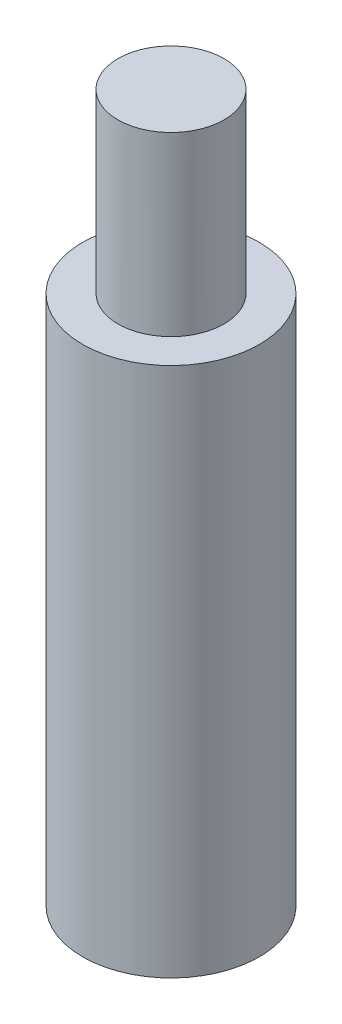
ISO-10303-21;
HEADER;
FILE_DESCRIPTION(('STEP AP214'),'2;1');
FILE_NAME('part.step','',(''),(''),'','','');
FILE_SCHEMA(('AUTOMOTIVE_DESIGN { 1 0 10303 214 1 1 1 1 }'));
ENDSEC;
DATA;
#1=APPLICATION_CONTEXT('core data for automotive mechanical design processes');
#2=APPLICATION_PROTOCOL_DEFINITION('international standard','automotive_design',2000,#1);
#3=PRODUCT_CONTEXT('',#1,'mechanical');
#4=PRODUCT('Part','Part','',(#3));
#5=PRODUCT_RELATED_PRODUCT_CATEGORY('part','',(#4));
#6=PRODUCT_DEFINITION_FORMATION('','',#4);
#7=PRODUCT_DEFINITION_CONTEXT('part definition',#1,'design');
#8=PRODUCT_DEFINITION('design','',#6,#7);
#9=PRODUCT_DEFINITION_SHAPE('','',#8);
#10=(LENGTH_UNIT() NAMED_UNIT(*) SI_UNIT(.MILLI.,.METRE.));
#11=(NAMED_UNIT(*) PLANE_ANGLE_UNIT() SI_UNIT($,.RADIAN.));
#12=(NAMED_UNIT(*) SI_UNIT($,.STERADIAN.) SOLID_ANGLE_UNIT());
#13=UNCERTAINTY_MEASURE_WITH_UNIT(LENGTH_MEASURE(1.E-05),#10,'distance_accuracy_value','');
#14=(GEOMETRIC_REPRESENTATION_CONTEXT(3) GLOBAL_UNCERTAINTY_ASSIGNED_CONTEXT((#13)) GLOBAL_UNIT_ASSIGNED_CONTEXT((#10,
#11,#12)) REPRESENTATION_CONTEXT('',''));
#15=CARTESIAN_POINT('',(0.,0.,0.));
#16=DIRECTION('',(0.,0.,1.));
#17=DIRECTION('',(1.,0.,0.));
#18=AXIS2_PLACEMENT_3D('',#15,#16,#17);
#19=CARTESIAN_POINT('',(0.,5.,0.));
#20=DIRECTION('',(0.,-1.,0.));
#21=DIRECTION('',(0.,0.,-1.));
#22=AXIS2_PLACEMENT_3D('',#19,#20,#21);
#23=CYLINDRICAL_SURFACE('',#22,1.5);
#24=CARTESIAN_POINT('',(0.,5.,0.));
#25=DIRECTION('',(0.,1.,0.));
#26=DIRECTION('',(0.,0.,1.));
#27=AXIS2_PLACEMENT_3D('',#24,#25,#26);
#28=CIRCLE('',#27,1.5);
#29=CARTESIAN_POINT('',(0.,5.,1.5));
#30=VERTEX_POINT('',#29);
#31=EDGE_CURVE('E10',#30,#30,#28,.T.);
#32=ORIENTED_EDGE('',*,*,#31,.F.);
#33=EDGE_LOOP('',(#32));
#34=FACE_BOUND('',#33,.T.);
#35=CARTESIAN_POINT('',(0.,0.,0.));
#36=DIRECTION('',(0.,-1.,0.));
#37=DIRECTION('',(0.,0.,-1.));
#38=AXIS2_PLACEMENT_3D('',#35,#36,#37);
#39=CIRCLE('',#38,1.5);
#40=CARTESIAN_POINT('',(0.,0.,-1.5));
#41=VERTEX_POINT('',#40);
#42=EDGE_CURVE('E36',#41,#41,#39,.T.);
#43=ORIENTED_EDGE('',*,*,#42,.F.);
#44=EDGE_LOOP('',(#43));
#45=FACE_BOUND('',#44,.T.);
#46=ADVANCED_FACE('F30',(#34,#45),#23,.T.);
#47=CARTESIAN_POINT('',(0.,5.,0.));
#48=DIRECTION('',(0.,1.,0.));
#49=DIRECTION('',(0.,0.,1.));
#50=AXIS2_PLACEMENT_3D('',#47,#48,#49);
#51=PLANE('',#50);
#52=ORIENTED_EDGE('',*,*,#31,.T.);
#53=EDGE_LOOP('',(#52));
#54=FACE_BOUND('',#53,.T.);
#55=ADVANCED_FACE('F54',(#54),#51,.T.);
#56=CARTESIAN_POINT('',(0.,0.,0.));
#57=DIRECTION('',(0.,-1.,0.));
#58=DIRECTION('',(0.,0.,-1.));
#59=AXIS2_PLACEMENT_3D('',#56,#57,#58);
#60=PLANE('',#59);
#61=CARTESIAN_POINT('',(0.,0.,0.));
#62=DIRECTION('',(0.,-1.,0.));
#63=DIRECTION('',(0.,0.,-1.));
#64=AXIS2_PLACEMENT_3D('',#61,#62,#63);
#65=CIRCLE('',#64,2.5);
#66=CARTESIAN_POINT('',(0.,0.,-2.5));
#67=VERTEX_POINT('',#66);
#68=EDGE_CURVE('E44',#67,#67,#65,.T.);
#69=ORIENTED_EDGE('',*,*,#68,.F.);
#70=EDGE_LOOP('',(#69));
#71=FACE_BOUND('',#70,.T.);
#72=ORIENTED_EDGE('',*,*,#42,.T.);
#73=EDGE_LOOP('',(#72));
#74=FACE_BOUND('',#73,.T.);
#75=ADVANCED_FACE('F52',(#71,#74),#60,.F.);
#76=CARTESIAN_POINT('',(0.,-15.,0.));
#77=DIRECTION('',(0.,1.,0.));
#78=DIRECTION('',(0.,0.,1.));
#79=AXIS2_PLACEMENT_3D('',#76,#77,#78);
#80=CYLINDRICAL_SURFACE('',#79,2.5);
#81=CARTESIAN_POINT('',(0.,-15.,0.));
#82=DIRECTION('',(0.,-1.,0.));
#83=DIRECTION('',(0.,0.,-1.));
#84=AXIS2_PLACEMENT_3D('',#81,#82,#83);
#85=CIRCLE('',#84,2.5);
#86=CARTESIAN_POINT('',(0.,-15.,-2.5));
#87=VERTEX_POINT('',#86);
#88=EDGE_CURVE('E40',#87,#87,#85,.T.);
#89=ORIENTED_EDGE('',*,*,#88,.F.);
#90=EDGE_LOOP('',(#89));
#91=FACE_BOUND('',#90,.T.);
#92=ORIENTED_EDGE('',*,*,#68,.T.);
#93=EDGE_LOOP('',(#92));
#94=FACE_BOUND('',#93,.T.);
#95=ADVANCED_FACE('F50',(#91,#94),#80,.T.);
#96=CARTESIAN_POINT('',(0.,-15.,0.));
#97=DIRECTION('',(0.,-1.,0.));
#98=DIRECTION('',(0.,0.,-1.));
#99=AXIS2_PLACEMENT_3D('',#96,#97,#98);
#100=PLANE('',#99);
#101=ORIENTED_EDGE('',*,*,#88,.T.);
#102=EDGE_LOOP('',(#101));
#103=FACE_BOUND('',#102,.T.);
#104=ADVANCED_FACE('F60',(#103),#100,.T.);
#105=CLOSED_SHELL('',(#46,#55,#75,#95,#104));
#106=MANIFOLD_SOLID_BREP('B2',#105);
#107=ADVANCED_BREP_SHAPE_REPRESENTATION('',(#18,#106),#14);
#108=SHAPE_DEFINITION_REPRESENTATION(#9,#107);
ENDSEC;
END-ISO-10303-21;
